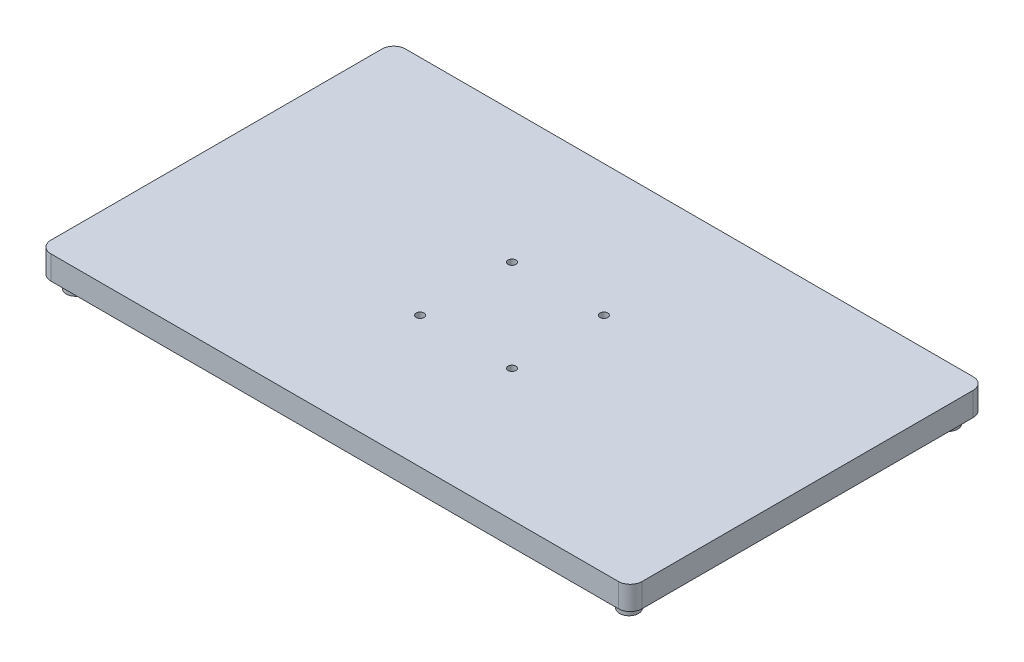
ISO-10303-21;
HEADER;
FILE_DESCRIPTION(('STEP AP214'),'2;1');
FILE_NAME('part.step','',(''),(''),'','','');
FILE_SCHEMA(('AUTOMOTIVE_DESIGN { 1 0 10303 214 1 1 1 1 }'));
ENDSEC;
DATA;
#1=APPLICATION_CONTEXT('core data for automotive mechanical design processes');
#2=APPLICATION_PROTOCOL_DEFINITION('international standard','automotive_design',2000,#1);
#3=PRODUCT_CONTEXT('',#1,'mechanical');
#4=PRODUCT('Part','Part','',(#3));
#5=PRODUCT_RELATED_PRODUCT_CATEGORY('part','',(#4));
#6=PRODUCT_DEFINITION_FORMATION('','',#4);
#7=PRODUCT_DEFINITION_CONTEXT('part definition',#1,'design');
#8=PRODUCT_DEFINITION('design','',#6,#7);
#9=PRODUCT_DEFINITION_SHAPE('','',#8);
#10=(LENGTH_UNIT() NAMED_UNIT(*) SI_UNIT(.MILLI.,.METRE.));
#11=(NAMED_UNIT(*) PLANE_ANGLE_UNIT() SI_UNIT($,.RADIAN.));
#12=(NAMED_UNIT(*) SI_UNIT($,.STERADIAN.) SOLID_ANGLE_UNIT());
#13=UNCERTAINTY_MEASURE_WITH_UNIT(LENGTH_MEASURE(1.E-05),#10,'distance_accuracy_value','');
#14=(GEOMETRIC_REPRESENTATION_CONTEXT(3) GLOBAL_UNCERTAINTY_ASSIGNED_CONTEXT((#13)) GLOBAL_UNIT_ASSIGNED_CONTEXT((#10,
#11,#12)) REPRESENTATION_CONTEXT('',''));
#15=CARTESIAN_POINT('',(0.,0.,0.));
#16=DIRECTION('',(0.,0.,1.));
#17=DIRECTION('',(1.,0.,0.));
#18=AXIS2_PLACEMENT_3D('',#15,#16,#17);
#19=CARTESIAN_POINT('',(-240.,20.,140.));
#20=DIRECTION('',(0.,-1.,0.));
#21=DIRECTION('',(0.,0.,-1.));
#22=AXIS2_PLACEMENT_3D('',#19,#20,#21);
#23=CYLINDRICAL_SURFACE('',#22,10.);
#24=CARTESIAN_POINT('',(-240.,0.,140.));
#25=DIRECTION('',(0.,1.,0.));
#26=DIRECTION('',(0.,0.,-1.));
#27=AXIS2_PLACEMENT_3D('',#24,#25,#26);
#28=CIRCLE('',#27,10.);
#29=CARTESIAN_POINT('',(-250.,0.,140.));
#30=VERTEX_POINT('',#29);
#31=CARTESIAN_POINT('',(-240.,0.,150.));
#32=VERTEX_POINT('',#31);
#33=EDGE_CURVE('E137',#30,#32,#28,.T.);
#34=ORIENTED_EDGE('',*,*,#33,.T.);
#35=DIRECTION('',(0.,-1.,0.));
#36=VECTOR('',#35,1.);
#37=CARTESIAN_POINT('',(-240.,20.,150.));
#38=LINE('',#37,#36);
#39=CARTESIAN_POINT('',(-240.,20.,150.));
#40=VERTEX_POINT('',#39);
#41=EDGE_CURVE('E165',#40,#32,#38,.T.);
#42=ORIENTED_EDGE('',*,*,#41,.F.);
#43=CARTESIAN_POINT('',(-240.,20.,140.));
#44=DIRECTION('',(0.,1.,0.));
#45=DIRECTION('',(0.,0.,-1.));
#46=AXIS2_PLACEMENT_3D('',#43,#44,#45);
#47=CIRCLE('',#46,10.);
#48=CARTESIAN_POINT('',(-250.,20.,140.));
#49=VERTEX_POINT('',#48);
#50=EDGE_CURVE('E152',#49,#40,#47,.T.);
#51=ORIENTED_EDGE('',*,*,#50,.F.);
#52=DIRECTION('',(0.,-1.,0.));
#53=VECTOR('',#52,1.);
#54=CARTESIAN_POINT('',(-250.,20.,140.));
#55=LINE('',#54,#53);
#56=EDGE_CURVE('E133',#49,#30,#55,.T.);
#57=ORIENTED_EDGE('',*,*,#56,.T.);
#58=EDGE_LOOP('',(#34,#42,#51,#57));
#59=FACE_BOUND('',#58,.T.);
#60=ADVANCED_FACE('F40',(#59),#23,.T.);
#61=CARTESIAN_POINT('',(240.,20.,150.));
#62=DIRECTION('',(0.,0.,-1.));
#63=DIRECTION('',(-1.,0.,0.));
#64=AXIS2_PLACEMENT_3D('',#61,#62,#63);
#65=PLANE('',#64);
#66=DIRECTION('',(1.,0.,0.));
#67=VECTOR('',#66,1.);
#68=CARTESIAN_POINT('',(240.,0.,150.));
#69=LINE('',#68,#67);
#70=CARTESIAN_POINT('',(240.,0.,150.));
#71=VERTEX_POINT('',#70);
#72=EDGE_CURVE('E140',#32,#71,#69,.T.);
#73=ORIENTED_EDGE('',*,*,#72,.T.);
#74=DIRECTION('',(0.,-1.,0.));
#75=VECTOR('',#74,1.);
#76=CARTESIAN_POINT('',(240.,20.,150.));
#77=LINE('',#76,#75);
#78=CARTESIAN_POINT('',(240.,20.,150.));
#79=VERTEX_POINT('',#78);
#80=EDGE_CURVE('E162',#79,#71,#77,.T.);
#81=ORIENTED_EDGE('',*,*,#80,.F.);
#82=DIRECTION('',(1.,0.,0.));
#83=VECTOR('',#82,1.);
#84=CARTESIAN_POINT('',(240.,20.,150.));
#85=LINE('',#84,#83);
#86=EDGE_CURVE('E100',#40,#79,#85,.T.);
#87=ORIENTED_EDGE('',*,*,#86,.F.);
#88=ORIENTED_EDGE('',*,*,#41,.T.);
#89=EDGE_LOOP('',(#73,#81,#87,#88));
#90=FACE_BOUND('',#89,.T.);
#91=ADVANCED_FACE('F223',(#90),#65,.F.);
#92=CARTESIAN_POINT('',(240.,20.,140.));
#93=DIRECTION('',(0.,-1.,0.));
#94=DIRECTION('',(0.,0.,-1.));
#95=AXIS2_PLACEMENT_3D('',#92,#93,#94);
#96=CYLINDRICAL_SURFACE('',#95,10.);
#97=CARTESIAN_POINT('',(240.,0.,140.));
#98=DIRECTION('',(0.,1.,0.));
#99=DIRECTION('',(0.,0.,-1.));
#100=AXIS2_PLACEMENT_3D('',#97,#98,#99);
#101=CIRCLE('',#100,10.);
#102=CARTESIAN_POINT('',(250.,0.,140.));
#103=VERTEX_POINT('',#102);
#104=EDGE_CURVE('E143',#71,#103,#101,.T.);
#105=ORIENTED_EDGE('',*,*,#104,.T.);
#106=DIRECTION('',(0.,-1.,0.));
#107=VECTOR('',#106,1.);
#108=CARTESIAN_POINT('',(250.,20.,140.));
#109=LINE('',#108,#107);
#110=CARTESIAN_POINT('',(250.,20.,140.));
#111=VERTEX_POINT('',#110);
#112=EDGE_CURVE('E159',#111,#103,#109,.T.);
#113=ORIENTED_EDGE('',*,*,#112,.F.);
#114=CARTESIAN_POINT('',(240.,20.,140.));
#115=DIRECTION('',(0.,1.,0.));
#116=DIRECTION('',(0.,0.,-1.));
#117=AXIS2_PLACEMENT_3D('',#114,#115,#116);
#118=CIRCLE('',#117,10.);
#119=EDGE_CURVE('E418',#79,#111,#118,.T.);
#120=ORIENTED_EDGE('',*,*,#119,.F.);
#121=ORIENTED_EDGE('',*,*,#80,.T.);
#122=EDGE_LOOP('',(#105,#113,#120,#121));
#123=FACE_BOUND('',#122,.T.);
#124=ADVANCED_FACE('F227',(#123),#96,.T.);
#125=CARTESIAN_POINT('',(250.,20.,140.));
#126=DIRECTION('',(-1.,0.,0.));
#127=DIRECTION('',(0.,0.,1.));
#128=AXIS2_PLACEMENT_3D('',#125,#126,#127);
#129=PLANE('',#128);
#130=DIRECTION('',(0.,0.,-1.));
#131=VECTOR('',#130,1.);
#132=CARTESIAN_POINT('',(250.,0.,140.));
#133=LINE('',#132,#131);
#134=CARTESIAN_POINT('',(250.,0.,-140.));
#135=VERTEX_POINT('',#134);
#136=EDGE_CURVE('E145',#103,#135,#133,.T.);
#137=ORIENTED_EDGE('',*,*,#136,.T.);
#138=DIRECTION('',(0.,-1.,0.));
#139=VECTOR('',#138,1.);
#140=CARTESIAN_POINT('',(250.,20.,-140.));
#141=LINE('',#140,#139);
#142=CARTESIAN_POINT('',(250.,20.,-140.));
#143=VERTEX_POINT('',#142);
#144=EDGE_CURVE('E156',#143,#135,#141,.T.);
#145=ORIENTED_EDGE('',*,*,#144,.F.);
#146=DIRECTION('',(0.,0.,-1.));
#147=VECTOR('',#146,1.);
#148=CARTESIAN_POINT('',(250.,20.,140.));
#149=LINE('',#148,#147);
#150=EDGE_CURVE('E420',#111,#143,#149,.T.);
#151=ORIENTED_EDGE('',*,*,#150,.F.);
#152=ORIENTED_EDGE('',*,*,#112,.T.);
#153=EDGE_LOOP('',(#137,#145,#151,#152));
#154=FACE_BOUND('',#153,.T.);
#155=ADVANCED_FACE('F231',(#154),#129,.F.);
#156=CARTESIAN_POINT('',(240.,20.,-140.));
#157=DIRECTION('',(0.,-1.,0.));
#158=DIRECTION('',(0.,0.,-1.));
#159=AXIS2_PLACEMENT_3D('',#156,#157,#158);
#160=CYLINDRICAL_SURFACE('',#159,10.);
#161=CARTESIAN_POINT('',(240.,0.,-140.));
#162=DIRECTION('',(0.,1.,0.));
#163=DIRECTION('',(0.,0.,1.));
#164=AXIS2_PLACEMENT_3D('',#161,#162,#163);
#165=CIRCLE('',#164,10.);
#166=CARTESIAN_POINT('',(240.,0.,-150.));
#167=VERTEX_POINT('',#166);
#168=EDGE_CURVE('E147',#135,#167,#165,.T.);
#169=ORIENTED_EDGE('',*,*,#168,.T.);
#170=DIRECTION('',(0.,-1.,0.));
#171=VECTOR('',#170,1.);
#172=CARTESIAN_POINT('',(240.,20.,-150.));
#173=LINE('',#172,#171);
#174=CARTESIAN_POINT('',(240.,20.,-150.));
#175=VERTEX_POINT('',#174);
#176=EDGE_CURVE('E128',#175,#167,#173,.T.);
#177=ORIENTED_EDGE('',*,*,#176,.F.);
#178=CARTESIAN_POINT('',(240.,20.,-140.));
#179=DIRECTION('',(0.,1.,0.));
#180=DIRECTION('',(0.,0.,1.));
#181=AXIS2_PLACEMENT_3D('',#178,#179,#180);
#182=CIRCLE('',#181,10.);
#183=EDGE_CURVE('E119',#143,#175,#182,.T.);
#184=ORIENTED_EDGE('',*,*,#183,.F.);
#185=ORIENTED_EDGE('',*,*,#144,.T.);
#186=EDGE_LOOP('',(#169,#177,#184,#185));
#187=FACE_BOUND('',#186,.T.);
#188=ADVANCED_FACE('F237',(#187),#160,.T.);
#189=CARTESIAN_POINT('',(240.,20.,-150.));
#190=DIRECTION('',(0.,0.,1.));
#191=DIRECTION('',(1.,0.,0.));
#192=AXIS2_PLACEMENT_3D('',#189,#190,#191);
#193=PLANE('',#192);
#194=DIRECTION('',(-1.,0.,0.));
#195=VECTOR('',#194,1.);
#196=CARTESIAN_POINT('',(240.,0.,-150.));
#197=LINE('',#196,#195);
#198=CARTESIAN_POINT('',(-240.,0.,-150.));
#199=VERTEX_POINT('',#198);
#200=EDGE_CURVE('E127',#167,#199,#197,.T.);
#201=ORIENTED_EDGE('',*,*,#200,.T.);
#202=DIRECTION('',(0.,-1.,0.));
#203=VECTOR('',#202,1.);
#204=CARTESIAN_POINT('',(-240.,20.,-150.));
#205=LINE('',#204,#203);
#206=CARTESIAN_POINT('',(-240.,20.,-150.));
#207=VERTEX_POINT('',#206);
#208=EDGE_CURVE('E124',#207,#199,#205,.T.);
#209=ORIENTED_EDGE('',*,*,#208,.F.);
#210=DIRECTION('',(-1.,0.,0.));
#211=VECTOR('',#210,1.);
#212=CARTESIAN_POINT('',(240.,20.,-150.));
#213=LINE('',#212,#211);
#214=EDGE_CURVE('E113',#175,#207,#213,.T.);
#215=ORIENTED_EDGE('',*,*,#214,.F.);
#216=ORIENTED_EDGE('',*,*,#176,.T.);
#217=EDGE_LOOP('',(#201,#209,#215,#216));
#218=FACE_BOUND('',#217,.T.);
#219=ADVANCED_FACE('F125',(#218),#193,.F.);
#220=CARTESIAN_POINT('',(-240.,20.,-140.));
#221=DIRECTION('',(0.,-1.,0.));
#222=DIRECTION('',(0.,0.,-1.));
#223=AXIS2_PLACEMENT_3D('',#220,#221,#222);
#224=CYLINDRICAL_SURFACE('',#223,10.);
#225=CARTESIAN_POINT('',(-240.,0.,-140.));
#226=DIRECTION('',(0.,1.,0.));
#227=DIRECTION('',(0.,0.,1.));
#228=AXIS2_PLACEMENT_3D('',#225,#226,#227);
#229=CIRCLE('',#228,10.);
#230=CARTESIAN_POINT('',(-250.,0.,-140.));
#231=VERTEX_POINT('',#230);
#232=EDGE_CURVE('E85',#199,#231,#229,.T.);
#233=ORIENTED_EDGE('',*,*,#232,.T.);
#234=DIRECTION('',(0.,-1.,0.));
#235=VECTOR('',#234,1.);
#236=CARTESIAN_POINT('',(-250.,20.,-140.));
#237=LINE('',#236,#235);
#238=CARTESIAN_POINT('',(-250.,20.,-140.));
#239=VERTEX_POINT('',#238);
#240=EDGE_CURVE('E129',#239,#231,#237,.T.);
#241=ORIENTED_EDGE('',*,*,#240,.F.);
#242=CARTESIAN_POINT('',(-240.,20.,-140.));
#243=DIRECTION('',(0.,1.,0.));
#244=DIRECTION('',(0.,0.,1.));
#245=AXIS2_PLACEMENT_3D('',#242,#243,#244);
#246=CIRCLE('',#245,10.);
#247=EDGE_CURVE('E117',#207,#239,#246,.T.);
#248=ORIENTED_EDGE('',*,*,#247,.F.);
#249=ORIENTED_EDGE('',*,*,#208,.T.);
#250=EDGE_LOOP('',(#233,#241,#248,#249));
#251=FACE_BOUND('',#250,.T.);
#252=ADVANCED_FACE('F131',(#251),#224,.T.);
#253=CARTESIAN_POINT('',(-250.,20.,140.));
#254=DIRECTION('',(1.,0.,0.));
#255=DIRECTION('',(0.,0.,-1.));
#256=AXIS2_PLACEMENT_3D('',#253,#254,#255);
#257=PLANE('',#256);
#258=DIRECTION('',(0.,0.,1.));
#259=VECTOR('',#258,1.);
#260=CARTESIAN_POINT('',(-250.,0.,140.));
#261=LINE('',#260,#259);
#262=EDGE_CURVE('E91',#231,#30,#261,.T.);
#263=ORIENTED_EDGE('',*,*,#262,.T.);
#264=ORIENTED_EDGE('',*,*,#56,.F.);
#265=DIRECTION('',(0.,0.,1.));
#266=VECTOR('',#265,1.);
#267=CARTESIAN_POINT('',(-250.,20.,140.));
#268=LINE('',#267,#266);
#269=EDGE_CURVE('E56',#239,#49,#268,.T.);
#270=ORIENTED_EDGE('',*,*,#269,.F.);
#271=ORIENTED_EDGE('',*,*,#240,.T.);
#272=EDGE_LOOP('',(#263,#264,#270,#271));
#273=FACE_BOUND('',#272,.T.);
#274=ADVANCED_FACE('F212',(#273),#257,.F.);
#275=CARTESIAN_POINT('',(-240.,20.,140.));
#276=DIRECTION('',(0.,-1.,0.));
#277=DIRECTION('',(0.,0.,-1.));
#278=AXIS2_PLACEMENT_3D('',#275,#276,#277);
#279=PLANE('',#278);
#280=CARTESIAN_POINT('',(-38.87,20.,-38.87));
#281=DIRECTION('',(0.,1.,0.));
#282=DIRECTION('',(0.,0.,1.));
#283=AXIS2_PLACEMENT_3D('',#280,#281,#282);
#284=CIRCLE('',#283,3.3);
#285=CARTESIAN_POINT('',(-38.87,20.,-35.57));
#286=VERTEX_POINT('',#285);
#287=EDGE_CURVE('E405',#286,#286,#284,.T.);
#288=ORIENTED_EDGE('',*,*,#287,.F.);
#289=EDGE_LOOP('',(#288));
#290=FACE_BOUND('',#289,.T.);
#291=CARTESIAN_POINT('',(38.87,20.,-38.87));
#292=DIRECTION('',(0.,1.,0.));
#293=DIRECTION('',(0.,0.,1.));
#294=AXIS2_PLACEMENT_3D('',#291,#292,#293);
#295=CIRCLE('',#294,3.3);
#296=CARTESIAN_POINT('',(38.87,20.,-35.57));
#297=VERTEX_POINT('',#296);
#298=EDGE_CURVE('E409',#297,#297,#295,.T.);
#299=ORIENTED_EDGE('',*,*,#298,.F.);
#300=EDGE_LOOP('',(#299));
#301=FACE_BOUND('',#300,.T.);
#302=CARTESIAN_POINT('',(38.87,20.,38.87));
#303=DIRECTION('',(0.,1.,0.));
#304=DIRECTION('',(0.,0.,1.));
#305=AXIS2_PLACEMENT_3D('',#302,#303,#304);
#306=CIRCLE('',#305,3.3);
#307=CARTESIAN_POINT('',(38.87,20.,42.17));
#308=VERTEX_POINT('',#307);
#309=EDGE_CURVE('E406',#308,#308,#306,.T.);
#310=ORIENTED_EDGE('',*,*,#309,.F.);
#311=EDGE_LOOP('',(#310));
#312=FACE_BOUND('',#311,.T.);
#313=CARTESIAN_POINT('',(-38.87,20.,38.87));
#314=DIRECTION('',(0.,1.,0.));
#315=DIRECTION('',(0.,0.,1.));
#316=AXIS2_PLACEMENT_3D('',#313,#314,#315);
#317=CIRCLE('',#316,3.3);
#318=CARTESIAN_POINT('',(-38.87,20.,42.17));
#319=VERTEX_POINT('',#318);
#320=EDGE_CURVE('E172',#319,#319,#317,.T.);
#321=ORIENTED_EDGE('',*,*,#320,.F.);
#322=EDGE_LOOP('',(#321));
#323=FACE_BOUND('',#322,.T.);
#324=ORIENTED_EDGE('',*,*,#50,.T.);
#325=ORIENTED_EDGE('',*,*,#86,.T.);
#326=ORIENTED_EDGE('',*,*,#119,.T.);
#327=ORIENTED_EDGE('',*,*,#150,.T.);
#328=ORIENTED_EDGE('',*,*,#183,.T.);
#329=ORIENTED_EDGE('',*,*,#214,.T.);
#330=ORIENTED_EDGE('',*,*,#247,.T.);
#331=ORIENTED_EDGE('',*,*,#269,.T.);
#332=EDGE_LOOP('',(#324,#325,#326,#327,#328,#329,#330,#331));
#333=FACE_BOUND('',#332,.T.);
#334=ADVANCED_FACE('F115',(#290,#301,#312,#323,#333),#279,.F.);
#335=CARTESIAN_POINT('',(-240.,0.,140.));
#336=DIRECTION('',(0.,-1.,0.));
#337=DIRECTION('',(0.,0.,-1.));
#338=AXIS2_PLACEMENT_3D('',#335,#336,#337);
#339=PLANE('',#338);
#340=CARTESIAN_POINT('',(-233.999999999997,0.,135.));
#341=DIRECTION('',(0.,-1.,0.));
#342=DIRECTION('',(0.,0.,-1.));
#343=AXIS2_PLACEMENT_3D('',#340,#341,#342);
#344=CIRCLE('',#343,8.00000000000001);
#345=CARTESIAN_POINT('',(-233.999999999997,0.,127.));
#346=VERTEX_POINT('',#345);
#347=EDGE_CURVE('E11',#346,#346,#344,.T.);
#348=ORIENTED_EDGE('',*,*,#347,.F.);
#349=EDGE_LOOP('',(#348));
#350=FACE_BOUND('',#349,.T.);
#351=CARTESIAN_POINT('',(234.000000000003,0.,135.));
#352=DIRECTION('',(0.,-1.,0.));
#353=DIRECTION('',(0.,0.,-1.));
#354=AXIS2_PLACEMENT_3D('',#351,#352,#353);
#355=CIRCLE('',#354,8.00000000000001);
#356=CARTESIAN_POINT('',(234.000000000003,0.,127.));
#357=VERTEX_POINT('',#356);
#358=EDGE_CURVE('E48',#357,#357,#355,.T.);
#359=ORIENTED_EDGE('',*,*,#358,.F.);
#360=EDGE_LOOP('',(#359));
#361=FACE_BOUND('',#360,.T.);
#362=CARTESIAN_POINT('',(234.,0.,-135.));
#363=DIRECTION('',(0.,-1.,0.));
#364=DIRECTION('',(0.,0.,-1.));
#365=AXIS2_PLACEMENT_3D('',#362,#363,#364);
#366=CIRCLE('',#365,8.00000000000001);
#367=CARTESIAN_POINT('',(234.,0.,-143.));
#368=VERTEX_POINT('',#367);
#369=EDGE_CURVE('E182',#368,#368,#366,.T.);
#370=ORIENTED_EDGE('',*,*,#369,.F.);
#371=EDGE_LOOP('',(#370));
#372=FACE_BOUND('',#371,.T.);
#373=CARTESIAN_POINT('',(-234.,0.,-135.));
#374=DIRECTION('',(0.,-1.,0.));
#375=DIRECTION('',(0.,0.,-1.));
#376=AXIS2_PLACEMENT_3D('',#373,#374,#375);
#377=CIRCLE('',#376,8.00000000000001);
#378=CARTESIAN_POINT('',(-234.,0.,-143.));
#379=VERTEX_POINT('',#378);
#380=EDGE_CURVE('E167',#379,#379,#377,.T.);
#381=ORIENTED_EDGE('',*,*,#380,.F.);
#382=EDGE_LOOP('',(#381));
#383=FACE_BOUND('',#382,.T.);
#384=CARTESIAN_POINT('',(-38.87,0.,-38.87));
#385=DIRECTION('',(0.,-1.,0.));
#386=DIRECTION('',(0.,0.,-1.));
#387=AXIS2_PLACEMENT_3D('',#384,#385,#386);
#388=CIRCLE('',#387,3.3);
#389=CARTESIAN_POINT('',(-38.87,0.,-35.57));
#390=VERTEX_POINT('',#389);
#391=EDGE_CURVE('E141',#390,#390,#388,.T.);
#392=ORIENTED_EDGE('',*,*,#391,.F.);
#393=EDGE_LOOP('',(#392));
#394=FACE_BOUND('',#393,.T.);
#395=CARTESIAN_POINT('',(38.87,0.,-38.87));
#396=DIRECTION('',(0.,-1.,0.));
#397=DIRECTION('',(0.,0.,-1.));
#398=AXIS2_PLACEMENT_3D('',#395,#396,#397);
#399=CIRCLE('',#398,3.3);
#400=CARTESIAN_POINT('',(38.87,0.,-35.57));
#401=VERTEX_POINT('',#400);
#402=EDGE_CURVE('E175',#401,#401,#399,.T.);
#403=ORIENTED_EDGE('',*,*,#402,.F.);
#404=EDGE_LOOP('',(#403));
#405=FACE_BOUND('',#404,.T.);
#406=CARTESIAN_POINT('',(38.87,0.,38.87));
#407=DIRECTION('',(0.,-1.,0.));
#408=DIRECTION('',(0.,0.,-1.));
#409=AXIS2_PLACEMENT_3D('',#406,#407,#408);
#410=CIRCLE('',#409,3.3);
#411=CARTESIAN_POINT('',(38.87,0.,42.17));
#412=VERTEX_POINT('',#411);
#413=EDGE_CURVE('E171',#412,#412,#410,.T.);
#414=ORIENTED_EDGE('',*,*,#413,.F.);
#415=EDGE_LOOP('',(#414));
#416=FACE_BOUND('',#415,.T.);
#417=CARTESIAN_POINT('',(-38.87,0.,38.87));
#418=DIRECTION('',(0.,-1.,0.));
#419=DIRECTION('',(0.,0.,-1.));
#420=AXIS2_PLACEMENT_3D('',#417,#418,#419);
#421=CIRCLE('',#420,3.3);
#422=CARTESIAN_POINT('',(-38.87,0.,42.17));
#423=VERTEX_POINT('',#422);
#424=EDGE_CURVE('E168',#423,#423,#421,.T.);
#425=ORIENTED_EDGE('',*,*,#424,.F.);
#426=EDGE_LOOP('',(#425));
#427=FACE_BOUND('',#426,.T.);
#428=ORIENTED_EDGE('',*,*,#33,.F.);
#429=ORIENTED_EDGE('',*,*,#262,.F.);
#430=ORIENTED_EDGE('',*,*,#232,.F.);
#431=ORIENTED_EDGE('',*,*,#200,.F.);
#432=ORIENTED_EDGE('',*,*,#168,.F.);
#433=ORIENTED_EDGE('',*,*,#136,.F.);
#434=ORIENTED_EDGE('',*,*,#104,.F.);
#435=ORIENTED_EDGE('',*,*,#72,.F.);
#436=EDGE_LOOP('',(#428,#429,#430,#431,#432,#433,#434,#435));
#437=FACE_BOUND('',#436,.T.);
#438=ADVANCED_FACE('F189',(#350,#361,#372,#383,#394,#405,#416,#427,#437),#339,.T.);
#439=CARTESIAN_POINT('',(-38.87,-1.2E-05,38.87));
#440=DIRECTION('',(0.,1.,0.));
#441=DIRECTION('',(0.,0.,1.));
#442=AXIS2_PLACEMENT_3D('',#439,#440,#441);
#443=CYLINDRICAL_SURFACE('',#442,3.3);
#444=CARTESIAN_POINT('',(-38.87,0.,42.17));
#445=CARTESIAN_POINT('',(-38.87,0.208333333333334,42.17));
#446=CARTESIAN_POINT('',(-38.87,0.416666666666667,42.17));
#447=CARTESIAN_POINT('',(-38.87,0.833333333333333,42.17));
#448=CARTESIAN_POINT('',(-38.87,1.04166666666667,42.17));
#449=CARTESIAN_POINT('',(-38.87,1.45833333333333,42.17));
#450=CARTESIAN_POINT('',(-38.87,1.66666666666667,42.17));
#451=CARTESIAN_POINT('',(-38.87,2.08333333333333,42.17));
#452=CARTESIAN_POINT('',(-38.87,2.29166666666667,42.17));
#453=CARTESIAN_POINT('',(-38.87,2.70833333333333,42.17));
#454=CARTESIAN_POINT('',(-38.87,2.91666666666667,42.17));
#455=CARTESIAN_POINT('',(-38.87,3.33333333333333,42.17));
#456=CARTESIAN_POINT('',(-38.87,3.54166666666667,42.17));
#457=CARTESIAN_POINT('',(-38.87,3.95833333333333,42.17));
#458=CARTESIAN_POINT('',(-38.87,4.16666666666667,42.17));
#459=CARTESIAN_POINT('',(-38.87,4.58333333333333,42.17));
#460=CARTESIAN_POINT('',(-38.87,4.79166666666667,42.17));
#461=CARTESIAN_POINT('',(-38.87,5.20833333333333,42.17));
#462=CARTESIAN_POINT('',(-38.87,5.41666666666667,42.17));
#463=CARTESIAN_POINT('',(-38.87,5.83333333333333,42.17));
#464=CARTESIAN_POINT('',(-38.87,6.04166666666667,42.17));
#465=CARTESIAN_POINT('',(-38.87,6.45833333333333,42.17));
#466=CARTESIAN_POINT('',(-38.87,6.66666666666667,42.17));
#467=CARTESIAN_POINT('',(-38.87,7.08333333333333,42.17));
#468=CARTESIAN_POINT('',(-38.87,7.29166666666667,42.17));
#469=CARTESIAN_POINT('',(-38.87,7.70833333333333,42.17));
#470=CARTESIAN_POINT('',(-38.87,7.91666666666667,42.17));
#471=CARTESIAN_POINT('',(-38.87,8.33333333333333,42.17));
#472=CARTESIAN_POINT('',(-38.87,8.54166666666667,42.17));
#473=CARTESIAN_POINT('',(-38.87,8.95833333333333,42.17));
#474=CARTESIAN_POINT('',(-38.87,9.16666666666667,42.17));
#475=CARTESIAN_POINT('',(-38.87,9.58333333333333,42.17));
#476=CARTESIAN_POINT('',(-38.87,9.79166666666667,42.17));
#477=CARTESIAN_POINT('',(-38.87,10.2083333333333,42.17));
#478=CARTESIAN_POINT('',(-38.87,10.4166666666667,42.17));
#479=CARTESIAN_POINT('',(-38.87,10.8333333333333,42.17));
#480=CARTESIAN_POINT('',(-38.87,11.0416666666667,42.17));
#481=CARTESIAN_POINT('',(-38.87,11.4583333333333,42.17));
#482=CARTESIAN_POINT('',(-38.87,11.6666666666667,42.17));
#483=CARTESIAN_POINT('',(-38.87,12.0833333333333,42.17));
#484=CARTESIAN_POINT('',(-38.87,12.2916666666667,42.17));
#485=CARTESIAN_POINT('',(-38.87,12.7083333333333,42.17));
#486=CARTESIAN_POINT('',(-38.87,12.9166666666667,42.17));
#487=CARTESIAN_POINT('',(-38.87,13.3333333333333,42.17));
#488=CARTESIAN_POINT('',(-38.87,13.5416666666667,42.17));
#489=CARTESIAN_POINT('',(-38.87,13.9583333333333,42.17));
#490=CARTESIAN_POINT('',(-38.87,14.1666666666667,42.17));
#491=CARTESIAN_POINT('',(-38.87,14.5833333333333,42.17));
#492=CARTESIAN_POINT('',(-38.87,14.7916666666667,42.17));
#493=CARTESIAN_POINT('',(-38.87,15.2083333333333,42.17));
#494=CARTESIAN_POINT('',(-38.87,15.4166666666667,42.17));
#495=CARTESIAN_POINT('',(-38.87,15.8333333333333,42.17));
#496=CARTESIAN_POINT('',(-38.87,16.0416666666667,42.17));
#497=CARTESIAN_POINT('',(-38.87,16.4583333333333,42.17));
#498=CARTESIAN_POINT('',(-38.87,16.6666666666667,42.17));
#499=CARTESIAN_POINT('',(-38.87,17.0833333333333,42.17));
#500=CARTESIAN_POINT('',(-38.87,17.2916666666667,42.17));
#501=CARTESIAN_POINT('',(-38.87,17.7083333333333,42.17));
#502=CARTESIAN_POINT('',(-38.87,17.9166666666667,42.17));
#503=CARTESIAN_POINT('',(-38.87,18.3333333333333,42.17));
#504=CARTESIAN_POINT('',(-38.87,18.5416666666667,42.17));
#505=CARTESIAN_POINT('',(-38.87,18.9583333333333,42.17));
#506=CARTESIAN_POINT('',(-38.87,19.1666666666667,42.17));
#507=CARTESIAN_POINT('',(-38.87,19.5833333333333,42.17));
#508=CARTESIAN_POINT('',(-38.87,19.7916666666667,42.17));
#509=CARTESIAN_POINT('',(-38.87,20.,42.17));
#510=B_SPLINE_CURVE_WITH_KNOTS('',3,(#444,#445,#446,#447,#448,#449,#450,#451,#452,#453,#454,
#455,#456,#457,#458,#459,#460,#461,#462,#463,#464,#465,#466,#467,#468,#469,#470,#471,#472,#473,
#474,#475,#476,#477,#478,#479,#480,#481,#482,#483,#484,#485,#486,#487,#488,#489,#490,#491,#492,
#493,#494,#495,#496,#497,#498,#499,#500,#501,#502,#503,#504,#505,#506,#507,#508,#509),
.UNSPECIFIED.,.F.,.F.,(4,2,2,2,2,2,2,2,2,2,2,2,2,2,2,2,2,2,2,2,2,2,2,2,2,2,2,2,2,2,2,2,4),(0.,
0.625,1.25,1.875,2.5,3.125,3.75,4.375,5.,5.625,6.25,6.875,7.5,8.125,8.75,9.375,10.,10.625,11.25,
11.875,12.5,13.125,13.75,14.375,15.,15.625,16.25,16.875,17.5,18.125,18.75,19.375,20.),.UNSPECIFIED.);
#511=EDGE_CURVE('BSEAM192',#423,#319,#510,.T.);
#512=ORIENTED_EDGE('',*,*,#424,.T.);
#513=ORIENTED_EDGE('',*,*,#320,.T.);
#514=ORIENTED_EDGE('',*,*,#511,.T.);
#515=ORIENTED_EDGE('',*,*,#511,.F.);
#516=EDGE_LOOP('',(#512,#514,#513,#515));
#517=FACE_BOUND('',#516,.T.);
#518=ADVANCED_FACE('F192',(#517),#443,.F.);
#519=CARTESIAN_POINT('',(38.87,-1.2E-05,38.87));
#520=DIRECTION('',(0.,1.,0.));
#521=DIRECTION('',(0.,0.,1.));
#522=AXIS2_PLACEMENT_3D('',#519,#520,#521);
#523=CYLINDRICAL_SURFACE('',#522,3.3);
#524=CARTESIAN_POINT('',(38.87,0.,42.17));
#525=CARTESIAN_POINT('',(38.87,0.208333333333334,42.17));
#526=CARTESIAN_POINT('',(38.87,0.416666666666667,42.17));
#527=CARTESIAN_POINT('',(38.87,0.833333333333333,42.17));
#528=CARTESIAN_POINT('',(38.87,1.04166666666667,42.17));
#529=CARTESIAN_POINT('',(38.87,1.45833333333333,42.17));
#530=CARTESIAN_POINT('',(38.87,1.66666666666667,42.17));
#531=CARTESIAN_POINT('',(38.87,2.08333333333333,42.17));
#532=CARTESIAN_POINT('',(38.87,2.29166666666667,42.17));
#533=CARTESIAN_POINT('',(38.87,2.70833333333333,42.17));
#534=CARTESIAN_POINT('',(38.87,2.91666666666667,42.17));
#535=CARTESIAN_POINT('',(38.87,3.33333333333333,42.17));
#536=CARTESIAN_POINT('',(38.87,3.54166666666667,42.17));
#537=CARTESIAN_POINT('',(38.87,3.95833333333333,42.17));
#538=CARTESIAN_POINT('',(38.87,4.16666666666667,42.17));
#539=CARTESIAN_POINT('',(38.87,4.58333333333333,42.17));
#540=CARTESIAN_POINT('',(38.87,4.79166666666667,42.17));
#541=CARTESIAN_POINT('',(38.87,5.20833333333333,42.17));
#542=CARTESIAN_POINT('',(38.87,5.41666666666667,42.17));
#543=CARTESIAN_POINT('',(38.87,5.83333333333333,42.17));
#544=CARTESIAN_POINT('',(38.87,6.04166666666667,42.17));
#545=CARTESIAN_POINT('',(38.87,6.45833333333333,42.17));
#546=CARTESIAN_POINT('',(38.87,6.66666666666667,42.17));
#547=CARTESIAN_POINT('',(38.87,7.08333333333333,42.17));
#548=CARTESIAN_POINT('',(38.87,7.29166666666667,42.17));
#549=CARTESIAN_POINT('',(38.87,7.70833333333333,42.17));
#550=CARTESIAN_POINT('',(38.87,7.91666666666667,42.17));
#551=CARTESIAN_POINT('',(38.87,8.33333333333333,42.17));
#552=CARTESIAN_POINT('',(38.87,8.54166666666667,42.17));
#553=CARTESIAN_POINT('',(38.87,8.95833333333333,42.17));
#554=CARTESIAN_POINT('',(38.87,9.16666666666667,42.17));
#555=CARTESIAN_POINT('',(38.87,9.58333333333333,42.17));
#556=CARTESIAN_POINT('',(38.87,9.79166666666667,42.17));
#557=CARTESIAN_POINT('',(38.87,10.2083333333333,42.17));
#558=CARTESIAN_POINT('',(38.87,10.4166666666667,42.17));
#559=CARTESIAN_POINT('',(38.87,10.8333333333333,42.17));
#560=CARTESIAN_POINT('',(38.87,11.0416666666667,42.17));
#561=CARTESIAN_POINT('',(38.87,11.4583333333333,42.17));
#562=CARTESIAN_POINT('',(38.87,11.6666666666667,42.17));
#563=CARTESIAN_POINT('',(38.87,12.0833333333333,42.17));
#564=CARTESIAN_POINT('',(38.87,12.2916666666667,42.17));
#565=CARTESIAN_POINT('',(38.87,12.7083333333333,42.17));
#566=CARTESIAN_POINT('',(38.87,12.9166666666667,42.17));
#567=CARTESIAN_POINT('',(38.87,13.3333333333333,42.17));
#568=CARTESIAN_POINT('',(38.87,13.5416666666667,42.17));
#569=CARTESIAN_POINT('',(38.87,13.9583333333333,42.17));
#570=CARTESIAN_POINT('',(38.87,14.1666666666667,42.17));
#571=CARTESIAN_POINT('',(38.87,14.5833333333333,42.17));
#572=CARTESIAN_POINT('',(38.87,14.7916666666667,42.17));
#573=CARTESIAN_POINT('',(38.87,15.2083333333333,42.17));
#574=CARTESIAN_POINT('',(38.87,15.4166666666667,42.17));
#575=CARTESIAN_POINT('',(38.87,15.8333333333333,42.17));
#576=CARTESIAN_POINT('',(38.87,16.0416666666667,42.17));
#577=CARTESIAN_POINT('',(38.87,16.4583333333333,42.17));
#578=CARTESIAN_POINT('',(38.87,16.6666666666667,42.17));
#579=CARTESIAN_POINT('',(38.87,17.0833333333333,42.17));
#580=CARTESIAN_POINT('',(38.87,17.2916666666667,42.17));
#581=CARTESIAN_POINT('',(38.87,17.7083333333333,42.17));
#582=CARTESIAN_POINT('',(38.87,17.9166666666667,42.17));
#583=CARTESIAN_POINT('',(38.87,18.3333333333333,42.17));
#584=CARTESIAN_POINT('',(38.87,18.5416666666667,42.17));
#585=CARTESIAN_POINT('',(38.87,18.9583333333333,42.17));
#586=CARTESIAN_POINT('',(38.87,19.1666666666667,42.17));
#587=CARTESIAN_POINT('',(38.87,19.5833333333333,42.17));
#588=CARTESIAN_POINT('',(38.87,19.7916666666667,42.17));
#589=CARTESIAN_POINT('',(38.87,20.,42.17));
#590=B_SPLINE_CURVE_WITH_KNOTS('',3,(#524,#525,#526,#527,#528,#529,#530,#531,#532,#533,#534,
#535,#536,#537,#538,#539,#540,#541,#542,#543,#544,#545,#546,#547,#548,#549,#550,#551,#552,#553,
#554,#555,#556,#557,#558,#559,#560,#561,#562,#563,#564,#565,#566,#567,#568,#569,#570,#571,#572,
#573,#574,#575,#576,#577,#578,#579,#580,#581,#582,#583,#584,#585,#586,#587,#588,#589),
.UNSPECIFIED.,.F.,.F.,(4,2,2,2,2,2,2,2,2,2,2,2,2,2,2,2,2,2,2,2,2,2,2,2,2,2,2,2,2,2,2,2,4),(0.,
0.625,1.25,1.875,2.5,3.125,3.75,4.375,5.,5.625,6.25,6.875,7.5,8.125,8.75,9.375,10.,10.625,11.25,
11.875,12.5,13.125,13.75,14.375,15.,15.625,16.25,16.875,17.5,18.125,18.75,19.375,20.),.UNSPECIFIED.);
#591=EDGE_CURVE('BSEAM272',#412,#308,#590,.T.);
#592=ORIENTED_EDGE('',*,*,#413,.T.);
#593=ORIENTED_EDGE('',*,*,#309,.T.);
#594=ORIENTED_EDGE('',*,*,#591,.T.);
#595=ORIENTED_EDGE('',*,*,#591,.F.);
#596=EDGE_LOOP('',(#592,#594,#593,#595));
#597=FACE_BOUND('',#596,.T.);
#598=ADVANCED_FACE('F272',(#597),#523,.F.);
#599=CARTESIAN_POINT('',(38.87,-1.2E-05,-38.87));
#600=DIRECTION('',(0.,1.,0.));
#601=DIRECTION('',(0.,0.,1.));
#602=AXIS2_PLACEMENT_3D('',#599,#600,#601);
#603=CYLINDRICAL_SURFACE('',#602,3.3);
#604=CARTESIAN_POINT('',(38.87,0.,-35.57));
#605=CARTESIAN_POINT('',(38.87,0.208333333333334,-35.57));
#606=CARTESIAN_POINT('',(38.87,0.416666666666667,-35.57));
#607=CARTESIAN_POINT('',(38.87,0.833333333333333,-35.57));
#608=CARTESIAN_POINT('',(38.87,1.04166666666667,-35.57));
#609=CARTESIAN_POINT('',(38.87,1.45833333333333,-35.57));
#610=CARTESIAN_POINT('',(38.87,1.66666666666667,-35.57));
#611=CARTESIAN_POINT('',(38.87,2.08333333333333,-35.57));
#612=CARTESIAN_POINT('',(38.87,2.29166666666667,-35.57));
#613=CARTESIAN_POINT('',(38.87,2.70833333333333,-35.57));
#614=CARTESIAN_POINT('',(38.87,2.91666666666667,-35.57));
#615=CARTESIAN_POINT('',(38.87,3.33333333333333,-35.57));
#616=CARTESIAN_POINT('',(38.87,3.54166666666667,-35.57));
#617=CARTESIAN_POINT('',(38.87,3.95833333333333,-35.57));
#618=CARTESIAN_POINT('',(38.87,4.16666666666667,-35.57));
#619=CARTESIAN_POINT('',(38.87,4.58333333333333,-35.57));
#620=CARTESIAN_POINT('',(38.87,4.79166666666667,-35.57));
#621=CARTESIAN_POINT('',(38.87,5.20833333333333,-35.57));
#622=CARTESIAN_POINT('',(38.87,5.41666666666667,-35.57));
#623=CARTESIAN_POINT('',(38.87,5.83333333333333,-35.57));
#624=CARTESIAN_POINT('',(38.87,6.04166666666667,-35.57));
#625=CARTESIAN_POINT('',(38.87,6.45833333333333,-35.57));
#626=CARTESIAN_POINT('',(38.87,6.66666666666667,-35.57));
#627=CARTESIAN_POINT('',(38.87,7.08333333333333,-35.57));
#628=CARTESIAN_POINT('',(38.87,7.29166666666667,-35.57));
#629=CARTESIAN_POINT('',(38.87,7.70833333333333,-35.57));
#630=CARTESIAN_POINT('',(38.87,7.91666666666667,-35.57));
#631=CARTESIAN_POINT('',(38.87,8.33333333333333,-35.57));
#632=CARTESIAN_POINT('',(38.87,8.54166666666667,-35.57));
#633=CARTESIAN_POINT('',(38.87,8.95833333333333,-35.57));
#634=CARTESIAN_POINT('',(38.87,9.16666666666667,-35.57));
#635=CARTESIAN_POINT('',(38.87,9.58333333333333,-35.57));
#636=CARTESIAN_POINT('',(38.87,9.79166666666667,-35.57));
#637=CARTESIAN_POINT('',(38.87,10.2083333333333,-35.57));
#638=CARTESIAN_POINT('',(38.87,10.4166666666667,-35.57));
#639=CARTESIAN_POINT('',(38.87,10.8333333333333,-35.57));
#640=CARTESIAN_POINT('',(38.87,11.0416666666667,-35.57));
#641=CARTESIAN_POINT('',(38.87,11.4583333333333,-35.57));
#642=CARTESIAN_POINT('',(38.87,11.6666666666667,-35.57));
#643=CARTESIAN_POINT('',(38.87,12.0833333333333,-35.57));
#644=CARTESIAN_POINT('',(38.87,12.2916666666667,-35.57));
#645=CARTESIAN_POINT('',(38.87,12.7083333333333,-35.57));
#646=CARTESIAN_POINT('',(38.87,12.9166666666667,-35.57));
#647=CARTESIAN_POINT('',(38.87,13.3333333333333,-35.57));
#648=CARTESIAN_POINT('',(38.87,13.5416666666667,-35.57));
#649=CARTESIAN_POINT('',(38.87,13.9583333333333,-35.57));
#650=CARTESIAN_POINT('',(38.87,14.1666666666667,-35.57));
#651=CARTESIAN_POINT('',(38.87,14.5833333333333,-35.57));
#652=CARTESIAN_POINT('',(38.87,14.7916666666667,-35.57));
#653=CARTESIAN_POINT('',(38.87,15.2083333333333,-35.57));
#654=CARTESIAN_POINT('',(38.87,15.4166666666667,-35.57));
#655=CARTESIAN_POINT('',(38.87,15.8333333333333,-35.57));
#656=CARTESIAN_POINT('',(38.87,16.0416666666667,-35.57));
#657=CARTESIAN_POINT('',(38.87,16.4583333333333,-35.57));
#658=CARTESIAN_POINT('',(38.87,16.6666666666667,-35.57));
#659=CARTESIAN_POINT('',(38.87,17.0833333333333,-35.57));
#660=CARTESIAN_POINT('',(38.87,17.2916666666667,-35.57));
#661=CARTESIAN_POINT('',(38.87,17.7083333333333,-35.57));
#662=CARTESIAN_POINT('',(38.87,17.9166666666667,-35.57));
#663=CARTESIAN_POINT('',(38.87,18.3333333333333,-35.57));
#664=CARTESIAN_POINT('',(38.87,18.5416666666667,-35.57));
#665=CARTESIAN_POINT('',(38.87,18.9583333333333,-35.57));
#666=CARTESIAN_POINT('',(38.87,19.1666666666667,-35.57));
#667=CARTESIAN_POINT('',(38.87,19.5833333333333,-35.57));
#668=CARTESIAN_POINT('',(38.87,19.7916666666667,-35.57));
#669=CARTESIAN_POINT('',(38.87,20.,-35.57));
#670=B_SPLINE_CURVE_WITH_KNOTS('',3,(#604,#605,#606,#607,#608,#609,#610,#611,#612,#613,#614,
#615,#616,#617,#618,#619,#620,#621,#622,#623,#624,#625,#626,#627,#628,#629,#630,#631,#632,#633,
#634,#635,#636,#637,#638,#639,#640,#641,#642,#643,#644,#645,#646,#647,#648,#649,#650,#651,#652,
#653,#654,#655,#656,#657,#658,#659,#660,#661,#662,#663,#664,#665,#666,#667,#668,#669),
.UNSPECIFIED.,.F.,.F.,(4,2,2,2,2,2,2,2,2,2,2,2,2,2,2,2,2,2,2,2,2,2,2,2,2,2,2,2,2,2,2,2,4),(0.,
0.625,1.25,1.875,2.5,3.125,3.75,4.375,5.,5.625,6.25,6.875,7.5,8.125,8.75,9.375,10.,10.625,11.25,
11.875,12.5,13.125,13.75,14.375,15.,15.625,16.25,16.875,17.5,18.125,18.75,19.375,20.),.UNSPECIFIED.);
#671=EDGE_CURVE('BSEAM282',#401,#297,#670,.T.);
#672=ORIENTED_EDGE('',*,*,#402,.T.);
#673=ORIENTED_EDGE('',*,*,#298,.T.);
#674=ORIENTED_EDGE('',*,*,#671,.T.);
#675=ORIENTED_EDGE('',*,*,#671,.F.);
#676=EDGE_LOOP('',(#672,#674,#673,#675));
#677=FACE_BOUND('',#676,.T.);
#678=ADVANCED_FACE('F282',(#677),#603,.F.);
#679=CARTESIAN_POINT('',(-38.87,-1.2E-05,-38.87));
#680=DIRECTION('',(0.,1.,0.));
#681=DIRECTION('',(0.,0.,1.));
#682=AXIS2_PLACEMENT_3D('',#679,#680,#681);
#683=CYLINDRICAL_SURFACE('',#682,3.3);
#684=CARTESIAN_POINT('',(-38.87,0.,-35.57));
#685=CARTESIAN_POINT('',(-38.87,0.208333333333334,-35.57));
#686=CARTESIAN_POINT('',(-38.87,0.416666666666667,-35.57));
#687=CARTESIAN_POINT('',(-38.87,0.833333333333333,-35.57));
#688=CARTESIAN_POINT('',(-38.87,1.04166666666667,-35.57));
#689=CARTESIAN_POINT('',(-38.87,1.45833333333333,-35.57));
#690=CARTESIAN_POINT('',(-38.87,1.66666666666667,-35.57));
#691=CARTESIAN_POINT('',(-38.87,2.08333333333333,-35.57));
#692=CARTESIAN_POINT('',(-38.87,2.29166666666667,-35.57));
#693=CARTESIAN_POINT('',(-38.87,2.70833333333333,-35.57));
#694=CARTESIAN_POINT('',(-38.87,2.91666666666667,-35.57));
#695=CARTESIAN_POINT('',(-38.87,3.33333333333333,-35.57));
#696=CARTESIAN_POINT('',(-38.87,3.54166666666667,-35.57));
#697=CARTESIAN_POINT('',(-38.87,3.95833333333333,-35.57));
#698=CARTESIAN_POINT('',(-38.87,4.16666666666667,-35.57));
#699=CARTESIAN_POINT('',(-38.87,4.58333333333333,-35.57));
#700=CARTESIAN_POINT('',(-38.87,4.79166666666667,-35.57));
#701=CARTESIAN_POINT('',(-38.87,5.20833333333333,-35.57));
#702=CARTESIAN_POINT('',(-38.87,5.41666666666667,-35.57));
#703=CARTESIAN_POINT('',(-38.87,5.83333333333333,-35.57));
#704=CARTESIAN_POINT('',(-38.87,6.04166666666667,-35.57));
#705=CARTESIAN_POINT('',(-38.87,6.45833333333333,-35.57));
#706=CARTESIAN_POINT('',(-38.87,6.66666666666667,-35.57));
#707=CARTESIAN_POINT('',(-38.87,7.08333333333333,-35.57));
#708=CARTESIAN_POINT('',(-38.87,7.29166666666667,-35.57));
#709=CARTESIAN_POINT('',(-38.87,7.70833333333333,-35.57));
#710=CARTESIAN_POINT('',(-38.87,7.91666666666667,-35.57));
#711=CARTESIAN_POINT('',(-38.87,8.33333333333333,-35.57));
#712=CARTESIAN_POINT('',(-38.87,8.54166666666667,-35.57));
#713=CARTESIAN_POINT('',(-38.87,8.95833333333333,-35.57));
#714=CARTESIAN_POINT('',(-38.87,9.16666666666667,-35.57));
#715=CARTESIAN_POINT('',(-38.87,9.58333333333333,-35.57));
#716=CARTESIAN_POINT('',(-38.87,9.79166666666667,-35.57));
#717=CARTESIAN_POINT('',(-38.87,10.2083333333333,-35.57));
#718=CARTESIAN_POINT('',(-38.87,10.4166666666667,-35.57));
#719=CARTESIAN_POINT('',(-38.87,10.8333333333333,-35.57));
#720=CARTESIAN_POINT('',(-38.87,11.0416666666667,-35.57));
#721=CARTESIAN_POINT('',(-38.87,11.4583333333333,-35.57));
#722=CARTESIAN_POINT('',(-38.87,11.6666666666667,-35.57));
#723=CARTESIAN_POINT('',(-38.87,12.0833333333333,-35.57));
#724=CARTESIAN_POINT('',(-38.87,12.2916666666667,-35.57));
#725=CARTESIAN_POINT('',(-38.87,12.7083333333333,-35.57));
#726=CARTESIAN_POINT('',(-38.87,12.9166666666667,-35.57));
#727=CARTESIAN_POINT('',(-38.87,13.3333333333333,-35.57));
#728=CARTESIAN_POINT('',(-38.87,13.5416666666667,-35.57));
#729=CARTESIAN_POINT('',(-38.87,13.9583333333333,-35.57));
#730=CARTESIAN_POINT('',(-38.87,14.1666666666667,-35.57));
#731=CARTESIAN_POINT('',(-38.87,14.5833333333333,-35.57));
#732=CARTESIAN_POINT('',(-38.87,14.7916666666667,-35.57));
#733=CARTESIAN_POINT('',(-38.87,15.2083333333333,-35.57));
#734=CARTESIAN_POINT('',(-38.87,15.4166666666667,-35.57));
#735=CARTESIAN_POINT('',(-38.87,15.8333333333333,-35.57));
#736=CARTESIAN_POINT('',(-38.87,16.0416666666667,-35.57));
#737=CARTESIAN_POINT('',(-38.87,16.4583333333333,-35.57));
#738=CARTESIAN_POINT('',(-38.87,16.6666666666667,-35.57));
#739=CARTESIAN_POINT('',(-38.87,17.0833333333333,-35.57));
#740=CARTESIAN_POINT('',(-38.87,17.2916666666667,-35.57));
#741=CARTESIAN_POINT('',(-38.87,17.7083333333333,-35.57));
#742=CARTESIAN_POINT('',(-38.87,17.9166666666667,-35.57));
#743=CARTESIAN_POINT('',(-38.87,18.3333333333333,-35.57));
#744=CARTESIAN_POINT('',(-38.87,18.5416666666667,-35.57));
#745=CARTESIAN_POINT('',(-38.87,18.9583333333333,-35.57));
#746=CARTESIAN_POINT('',(-38.87,19.1666666666667,-35.57));
#747=CARTESIAN_POINT('',(-38.87,19.5833333333333,-35.57));
#748=CARTESIAN_POINT('',(-38.87,19.7916666666667,-35.57));
#749=CARTESIAN_POINT('',(-38.87,20.,-35.57));
#750=B_SPLINE_CURVE_WITH_KNOTS('',3,(#684,#685,#686,#687,#688,#689,#690,#691,#692,#693,#694,
#695,#696,#697,#698,#699,#700,#701,#702,#703,#704,#705,#706,#707,#708,#709,#710,#711,#712,#713,
#714,#715,#716,#717,#718,#719,#720,#721,#722,#723,#724,#725,#726,#727,#728,#729,#730,#731,#732,
#733,#734,#735,#736,#737,#738,#739,#740,#741,#742,#743,#744,#745,#746,#747,#748,#749),
.UNSPECIFIED.,.F.,.F.,(4,2,2,2,2,2,2,2,2,2,2,2,2,2,2,2,2,2,2,2,2,2,2,2,2,2,2,2,2,2,2,2,4),(0.,
0.625,1.25,1.875,2.5,3.125,3.75,4.375,5.,5.625,6.25,6.875,7.5,8.125,8.75,9.375,10.,10.625,11.25,
11.875,12.5,13.125,13.75,14.375,15.,15.625,16.25,16.875,17.5,18.125,18.75,19.375,20.),.UNSPECIFIED.);
#751=EDGE_CURVE('BSEAM292',#390,#286,#750,.T.);
#752=ORIENTED_EDGE('',*,*,#391,.T.);
#753=ORIENTED_EDGE('',*,*,#287,.T.);
#754=ORIENTED_EDGE('',*,*,#751,.T.);
#755=ORIENTED_EDGE('',*,*,#751,.F.);
#756=EDGE_LOOP('',(#752,#754,#753,#755));
#757=FACE_BOUND('',#756,.T.);
#758=ADVANCED_FACE('F292',(#757),#683,.F.);
#759=CARTESIAN_POINT('',(-234.,-10.,-135.));
#760=DIRECTION('',(0.,1.,0.));
#761=DIRECTION('',(0.,0.,1.));
#762=AXIS2_PLACEMENT_3D('',#759,#760,#761);
#763=CYLINDRICAL_SURFACE('',#762,8.00000000000001);
#764=CARTESIAN_POINT('',(-234.,-10.,-135.));
#765=DIRECTION('',(0.,1.,0.));
#766=DIRECTION('',(0.,0.,1.));
#767=AXIS2_PLACEMENT_3D('',#764,#765,#766);
#768=CIRCLE('',#767,8.00000000000001);
#769=CARTESIAN_POINT('',(-234.,-10.,-127.));
#770=VERTEX_POINT('',#769);
#771=EDGE_CURVE('E402',#770,#770,#768,.T.);
#772=ORIENTED_EDGE('',*,*,#771,.T.);
#773=EDGE_LOOP('',(#772));
#774=FACE_BOUND('',#773,.T.);
#775=ORIENTED_EDGE('',*,*,#380,.T.);
#776=EDGE_LOOP('',(#775));
#777=FACE_BOUND('',#776,.T.);
#778=ADVANCED_FACE('F302',(#774,#777),#763,.T.);
#779=CARTESIAN_POINT('',(-234.,-10.,-135.));
#780=DIRECTION('',(0.,1.,0.));
#781=DIRECTION('',(0.,0.,1.));
#782=AXIS2_PLACEMENT_3D('',#779,#780,#781);
#783=PLANE('',#782);
#784=ORIENTED_EDGE('',*,*,#771,.F.);
#785=EDGE_LOOP('',(#784));
#786=FACE_BOUND('',#785,.T.);
#787=ADVANCED_FACE('F317',(#786),#783,.F.);
#788=CARTESIAN_POINT('',(234.,-10.,-135.));
#789=DIRECTION('',(0.,1.,0.));
#790=DIRECTION('',(0.,0.,1.));
#791=AXIS2_PLACEMENT_3D('',#788,#789,#790);
#792=CYLINDRICAL_SURFACE('',#791,8.00000000000001);
#793=CARTESIAN_POINT('',(234.,-10.,-135.));
#794=DIRECTION('',(0.,1.,0.));
#795=DIRECTION('',(0.,0.,1.));
#796=AXIS2_PLACEMENT_3D('',#793,#794,#795);
#797=CIRCLE('',#796,8.00000000000001);
#798=CARTESIAN_POINT('',(234.,-10.,-127.));
#799=VERTEX_POINT('',#798);
#800=EDGE_CURVE('E397',#799,#799,#797,.T.);
#801=ORIENTED_EDGE('',*,*,#800,.T.);
#802=EDGE_LOOP('',(#801));
#803=FACE_BOUND('',#802,.T.);
#804=ORIENTED_EDGE('',*,*,#369,.T.);
#805=EDGE_LOOP('',(#804));
#806=FACE_BOUND('',#805,.T.);
#807=ADVANCED_FACE('F327',(#803,#806),#792,.T.);
#808=CARTESIAN_POINT('',(234.,-10.,-135.));
#809=DIRECTION('',(0.,1.,0.));
#810=DIRECTION('',(0.,0.,1.));
#811=AXIS2_PLACEMENT_3D('',#808,#809,#810);
#812=PLANE('',#811);
#813=ORIENTED_EDGE('',*,*,#800,.F.);
#814=EDGE_LOOP('',(#813));
#815=FACE_BOUND('',#814,.T.);
#816=ADVANCED_FACE('F337',(#815),#812,.F.);
#817=CARTESIAN_POINT('',(234.000000000003,-10.,135.));
#818=DIRECTION('',(0.,1.,0.));
#819=DIRECTION('',(0.,0.,1.));
#820=AXIS2_PLACEMENT_3D('',#817,#818,#819);
#821=CYLINDRICAL_SURFACE('',#820,8.00000000000001);
#822=CARTESIAN_POINT('',(234.000000000003,-10.,135.));
#823=DIRECTION('',(0.,1.,0.));
#824=DIRECTION('',(0.,0.,1.));
#825=AXIS2_PLACEMENT_3D('',#822,#823,#824);
#826=CIRCLE('',#825,8.00000000000001);
#827=CARTESIAN_POINT('',(234.000000000003,-10.,143.));
#828=VERTEX_POINT('',#827);
#829=EDGE_CURVE('E394',#828,#828,#826,.T.);
#830=ORIENTED_EDGE('',*,*,#829,.T.);
#831=EDGE_LOOP('',(#830));
#832=FACE_BOUND('',#831,.T.);
#833=ORIENTED_EDGE('',*,*,#358,.T.);
#834=EDGE_LOOP('',(#833));
#835=FACE_BOUND('',#834,.T.);
#836=ADVANCED_FACE('F187',(#832,#835),#821,.T.);
#837=CARTESIAN_POINT('',(234.000000000003,-10.,135.));
#838=DIRECTION('',(0.,1.,0.));
#839=DIRECTION('',(0.,0.,1.));
#840=AXIS2_PLACEMENT_3D('',#837,#838,#839);
#841=PLANE('',#840);
#842=ORIENTED_EDGE('',*,*,#829,.F.);
#843=EDGE_LOOP('',(#842));
#844=FACE_BOUND('',#843,.T.);
#845=ADVANCED_FACE('F356',(#844),#841,.F.);
#846=CARTESIAN_POINT('',(-233.999999999997,-10.,135.));
#847=DIRECTION('',(0.,1.,0.));
#848=DIRECTION('',(0.,0.,1.));
#849=AXIS2_PLACEMENT_3D('',#846,#847,#848);
#850=CYLINDRICAL_SURFACE('',#849,8.00000000000001);
#851=CARTESIAN_POINT('',(-233.999999999997,-10.,135.));
#852=DIRECTION('',(0.,1.,0.));
#853=DIRECTION('',(0.,0.,1.));
#854=AXIS2_PLACEMENT_3D('',#851,#852,#853);
#855=CIRCLE('',#854,8.00000000000001);
#856=CARTESIAN_POINT('',(-233.999999999997,-10.,143.));
#857=VERTEX_POINT('',#856);
#858=EDGE_CURVE('E393',#857,#857,#855,.T.);
#859=ORIENTED_EDGE('',*,*,#858,.T.);
#860=EDGE_LOOP('',(#859));
#861=FACE_BOUND('',#860,.T.);
#862=ORIENTED_EDGE('',*,*,#347,.T.);
#863=EDGE_LOOP('',(#862));
#864=FACE_BOUND('',#863,.T.);
#865=ADVANCED_FACE('F366',(#861,#864),#850,.T.);
#866=CARTESIAN_POINT('',(-233.999999999997,-10.,135.));
#867=DIRECTION('',(0.,1.,0.));
#868=DIRECTION('',(0.,0.,1.));
#869=AXIS2_PLACEMENT_3D('',#866,#867,#868);
#870=PLANE('',#869);
#871=ORIENTED_EDGE('',*,*,#858,.F.);
#872=EDGE_LOOP('',(#871));
#873=FACE_BOUND('',#872,.T.);
#874=ADVANCED_FACE('F376',(#873),#870,.F.);
#875=CLOSED_SHELL('',(#60,#91,#124,#155,#188,#219,#252,#274,#334,#438,#518,#598,#678,#758,#778,
#787,#807,#816,#836,#845,#865,#874));
#876=MANIFOLD_SOLID_BREP('B2',#875);
#877=ADVANCED_BREP_SHAPE_REPRESENTATION('',(#18,#876),#14);
#878=SHAPE_DEFINITION_REPRESENTATION(#9,#877);
ENDSEC;
END-ISO-10303-21;
